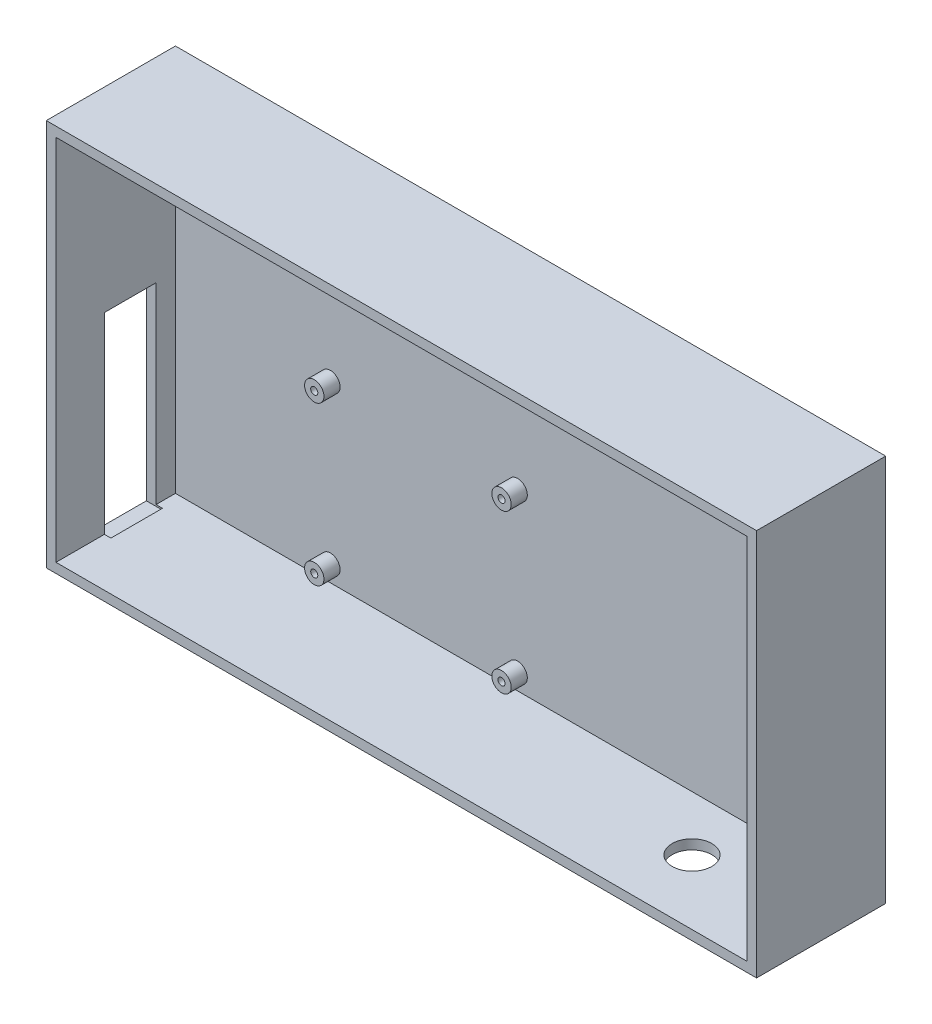
ISO-10303-21;
HEADER;
FILE_DESCRIPTION(('STEP AP214'),'2;1');
FILE_NAME('part.step','',(''),(''),'','','');
FILE_SCHEMA(('AUTOMOTIVE_DESIGN { 1 0 10303 214 1 1 1 1 }'));
ENDSEC;
DATA;
#1=APPLICATION_CONTEXT('core data for automotive mechanical design processes');
#2=APPLICATION_PROTOCOL_DEFINITION('international standard','automotive_design',2000,#1);
#3=PRODUCT_CONTEXT('',#1,'mechanical');
#4=PRODUCT('Part','Part','',(#3));
#5=PRODUCT_RELATED_PRODUCT_CATEGORY('part','',(#4));
#6=PRODUCT_DEFINITION_FORMATION('','',#4);
#7=PRODUCT_DEFINITION_CONTEXT('part definition',#1,'design');
#8=PRODUCT_DEFINITION('design','',#6,#7);
#9=PRODUCT_DEFINITION_SHAPE('','',#8);
#10=(LENGTH_UNIT() NAMED_UNIT(*) SI_UNIT(.MILLI.,.METRE.));
#11=(NAMED_UNIT(*) PLANE_ANGLE_UNIT() SI_UNIT($,.RADIAN.));
#12=(NAMED_UNIT(*) SI_UNIT($,.STERADIAN.) SOLID_ANGLE_UNIT());
#13=UNCERTAINTY_MEASURE_WITH_UNIT(LENGTH_MEASURE(1.E-05),#10,'distance_accuracy_value','');
#14=(GEOMETRIC_REPRESENTATION_CONTEXT(3) GLOBAL_UNCERTAINTY_ASSIGNED_CONTEXT((#13)) GLOBAL_UNIT_ASSIGNED_CONTEXT((#10,
#11,#12)) REPRESENTATION_CONTEXT('',''));
#15=CARTESIAN_POINT('',(0.,0.,0.));
#16=DIRECTION('',(0.,0.,1.));
#17=DIRECTION('',(1.,0.,0.));
#18=AXIS2_PLACEMENT_3D('',#15,#16,#17);
#19=CARTESIAN_POINT('',(0.,0.,40.));
#20=DIRECTION('',(0.,0.,1.));
#21=DIRECTION('',(1.,0.,0.));
#22=AXIS2_PLACEMENT_3D('',#19,#20,#21);
#23=PLANE('',#22);
#24=DIRECTION('',(-1.,0.,0.));
#25=VECTOR('',#24,1.);
#26=CARTESIAN_POINT('',(0.,-57.,40.));
#27=LINE('',#26,#25);
#28=CARTESIAN_POINT('',(107.,-57.,40.));
#29=VERTEX_POINT('',#28);
#30=CARTESIAN_POINT('',(-107.,-57.,40.));
#31=VERTEX_POINT('',#30);
#32=EDGE_CURVE('E220',#29,#31,#27,.T.);
#33=ORIENTED_EDGE('',*,*,#32,.T.);
#34=DIRECTION('',(0.,1.,0.));
#35=VECTOR('',#34,1.);
#36=CARTESIAN_POINT('',(-107.,0.,40.));
#37=LINE('',#36,#35);
#38=CARTESIAN_POINT('',(-107.,57.,40.));
#39=VERTEX_POINT('',#38);
#40=EDGE_CURVE('E212',#31,#39,#37,.T.);
#41=ORIENTED_EDGE('',*,*,#40,.T.);
#42=DIRECTION('',(1.,0.,0.));
#43=VECTOR('',#42,1.);
#44=CARTESIAN_POINT('',(0.,57.,40.));
#45=LINE('',#44,#43);
#46=CARTESIAN_POINT('',(107.,57.,40.));
#47=VERTEX_POINT('',#46);
#48=EDGE_CURVE('E211',#39,#47,#45,.T.);
#49=ORIENTED_EDGE('',*,*,#48,.T.);
#50=DIRECTION('',(0.,-1.,0.));
#51=VECTOR('',#50,1.);
#52=CARTESIAN_POINT('',(107.,0.,40.));
#53=LINE('',#52,#51);
#54=EDGE_CURVE('E208',#47,#29,#53,.T.);
#55=ORIENTED_EDGE('',*,*,#54,.T.);
#56=EDGE_LOOP('',(#33,#41,#49,#55));
#57=FACE_BOUND('',#56,.T.);
#58=DIRECTION('',(-1.,0.,0.));
#59=VECTOR('',#58,1.);
#60=CARTESIAN_POINT('',(0.,-60.,40.));
#61=LINE('',#60,#59);
#62=CARTESIAN_POINT('',(110.,-60.,40.));
#63=VERTEX_POINT('',#62);
#64=CARTESIAN_POINT('',(-110.,-60.,40.));
#65=VERTEX_POINT('',#64);
#66=EDGE_CURVE('E253',#63,#65,#61,.T.);
#67=ORIENTED_EDGE('',*,*,#66,.F.);
#68=DIRECTION('',(0.,-1.,0.));
#69=VECTOR('',#68,1.);
#70=CARTESIAN_POINT('',(110.,0.,40.));
#71=LINE('',#70,#69);
#72=CARTESIAN_POINT('',(110.,60.,40.));
#73=VERTEX_POINT('',#72);
#74=EDGE_CURVE('E243',#73,#63,#71,.T.);
#75=ORIENTED_EDGE('',*,*,#74,.F.);
#76=DIRECTION('',(1.,0.,0.));
#77=VECTOR('',#76,1.);
#78=CARTESIAN_POINT('',(0.,60.,40.));
#79=LINE('',#78,#77);
#80=CARTESIAN_POINT('',(-110.,60.,40.));
#81=VERTEX_POINT('',#80);
#82=EDGE_CURVE('E250',#81,#73,#79,.T.);
#83=ORIENTED_EDGE('',*,*,#82,.F.);
#84=DIRECTION('',(0.,1.,0.));
#85=VECTOR('',#84,1.);
#86=CARTESIAN_POINT('',(-110.,0.,40.));
#87=LINE('',#86,#85);
#88=EDGE_CURVE('E247',#65,#81,#87,.T.);
#89=ORIENTED_EDGE('',*,*,#88,.F.);
#90=EDGE_LOOP('',(#67,#75,#83,#89));
#91=FACE_BOUND('',#90,.T.);
#92=ADVANCED_FACE('F16',(#57,#91),#23,.T.);
#93=CARTESIAN_POINT('',(0.,-60.,0.));
#94=DIRECTION('',(0.,-1.,0.));
#95=DIRECTION('',(0.,0.,-1.));
#96=AXIS2_PLACEMENT_3D('',#93,#94,#95);
#97=PLANE('',#96);
#98=CARTESIAN_POINT('',(70.,-60.,20.));
#99=DIRECTION('',(0.,-1.,0.));
#100=DIRECTION('',(0.,0.,-1.));
#101=AXIS2_PLACEMENT_3D('',#98,#99,#100);
#102=CIRCLE('',#101,6.15);
#103=CARTESIAN_POINT('',(70.,-60.,13.85));
#104=VERTEX_POINT('',#103);
#105=EDGE_CURVE('E153',#104,#104,#102,.T.);
#106=ORIENTED_EDGE('',*,*,#105,.F.);
#107=EDGE_LOOP('',(#106));
#108=FACE_BOUND('',#107,.T.);
#109=DIRECTION('',(0.,0.,1.));
#110=VECTOR('',#109,1.);
#111=CARTESIAN_POINT('',(110.,-60.,0.));
#112=LINE('',#111,#110);
#113=CARTESIAN_POINT('',(110.,-60.,0.));
#114=VERTEX_POINT('',#113);
#115=EDGE_CURVE('E227',#114,#63,#112,.T.);
#116=ORIENTED_EDGE('',*,*,#115,.T.);
#117=ORIENTED_EDGE('',*,*,#66,.T.);
#118=DIRECTION('',(0.,0.,1.));
#119=VECTOR('',#118,1.);
#120=CARTESIAN_POINT('',(-110.,-60.,0.));
#121=LINE('',#120,#119);
#122=CARTESIAN_POINT('',(-110.,-60.,0.));
#123=VERTEX_POINT('',#122);
#124=EDGE_CURVE('E241',#123,#65,#121,.T.);
#125=ORIENTED_EDGE('',*,*,#124,.F.);
#126=DIRECTION('',(1.,0.,0.));
#127=VECTOR('',#126,1.);
#128=CARTESIAN_POINT('',(0.,-60.,0.));
#129=LINE('',#128,#127);
#130=EDGE_CURVE('E219',#123,#114,#129,.T.);
#131=ORIENTED_EDGE('',*,*,#130,.T.);
#132=EDGE_LOOP('',(#116,#117,#125,#131));
#133=FACE_BOUND('',#132,.T.);
#134=ADVANCED_FACE('F313',(#108,#133),#97,.T.);
#135=CARTESIAN_POINT('',(-110.,0.,0.));
#136=DIRECTION('',(-1.,0.,0.));
#137=DIRECTION('',(0.,0.,1.));
#138=AXIS2_PLACEMENT_3D('',#135,#136,#137);
#139=PLANE('',#138);
#140=DIRECTION('',(0.,1.,0.));
#141=VECTOR('',#140,1.);
#142=CARTESIAN_POINT('',(-110.,0.,25.));
#143=LINE('',#142,#141);
#144=CARTESIAN_POINT('',(-110.,-57.5,25.));
#145=VERTEX_POINT('',#144);
#146=CARTESIAN_POINT('',(-110.,2.5,25.));
#147=VERTEX_POINT('',#146);
#148=EDGE_CURVE('E147',#145,#147,#143,.T.);
#149=ORIENTED_EDGE('',*,*,#148,.F.);
#150=DIRECTION('',(0.,0.,1.));
#151=VECTOR('',#150,1.);
#152=CARTESIAN_POINT('',(-110.,-57.5,0.));
#153=LINE('',#152,#151);
#154=CARTESIAN_POINT('',(-110.,-57.5,9.));
#155=VERTEX_POINT('',#154);
#156=EDGE_CURVE('E10',#155,#145,#153,.T.);
#157=ORIENTED_EDGE('',*,*,#156,.F.);
#158=DIRECTION('',(0.,-1.,0.));
#159=VECTOR('',#158,1.);
#160=CARTESIAN_POINT('',(-110.,0.,9.));
#161=LINE('',#160,#159);
#162=CARTESIAN_POINT('',(-110.,2.5,9.));
#163=VERTEX_POINT('',#162);
#164=EDGE_CURVE('E118',#163,#155,#161,.T.);
#165=ORIENTED_EDGE('',*,*,#164,.F.);
#166=DIRECTION('',(0.,0.,-1.));
#167=VECTOR('',#166,1.);
#168=CARTESIAN_POINT('',(-110.,2.5,0.));
#169=LINE('',#168,#167);
#170=EDGE_CURVE('E144',#147,#163,#169,.T.);
#171=ORIENTED_EDGE('',*,*,#170,.F.);
#172=EDGE_LOOP('',(#149,#157,#165,#171));
#173=FACE_BOUND('',#172,.T.);
#174=ORIENTED_EDGE('',*,*,#124,.T.);
#175=ORIENTED_EDGE('',*,*,#88,.T.);
#176=DIRECTION('',(0.,0.,1.));
#177=VECTOR('',#176,1.);
#178=CARTESIAN_POINT('',(-110.,60.,0.));
#179=LINE('',#178,#177);
#180=CARTESIAN_POINT('',(-110.,60.,0.));
#181=VERTEX_POINT('',#180);
#182=EDGE_CURVE('E238',#181,#81,#179,.T.);
#183=ORIENTED_EDGE('',*,*,#182,.F.);
#184=DIRECTION('',(0.,-1.,0.));
#185=VECTOR('',#184,1.);
#186=CARTESIAN_POINT('',(-110.,0.,0.));
#187=LINE('',#186,#185);
#188=EDGE_CURVE('E224',#181,#123,#187,.T.);
#189=ORIENTED_EDGE('',*,*,#188,.T.);
#190=EDGE_LOOP('',(#174,#175,#183,#189));
#191=FACE_BOUND('',#190,.T.);
#192=ADVANCED_FACE('F307',(#173,#191),#139,.T.);
#193=CARTESIAN_POINT('',(0.,60.,0.));
#194=DIRECTION('',(0.,1.,0.));
#195=DIRECTION('',(0.,0.,1.));
#196=AXIS2_PLACEMENT_3D('',#193,#194,#195);
#197=PLANE('',#196);
#198=ORIENTED_EDGE('',*,*,#182,.T.);
#199=ORIENTED_EDGE('',*,*,#82,.T.);
#200=DIRECTION('',(0.,0.,1.));
#201=VECTOR('',#200,1.);
#202=CARTESIAN_POINT('',(110.,60.,0.));
#203=LINE('',#202,#201);
#204=CARTESIAN_POINT('',(110.,60.,0.));
#205=VERTEX_POINT('',#204);
#206=EDGE_CURVE('E234',#205,#73,#203,.T.);
#207=ORIENTED_EDGE('',*,*,#206,.F.);
#208=DIRECTION('',(-1.,0.,0.));
#209=VECTOR('',#208,1.);
#210=CARTESIAN_POINT('',(0.,60.,0.));
#211=LINE('',#210,#209);
#212=EDGE_CURVE('E229',#205,#181,#211,.T.);
#213=ORIENTED_EDGE('',*,*,#212,.T.);
#214=EDGE_LOOP('',(#198,#199,#207,#213));
#215=FACE_BOUND('',#214,.T.);
#216=ADVANCED_FACE('F309',(#215),#197,.T.);
#217=CARTESIAN_POINT('',(0.,0.,0.));
#218=DIRECTION('',(0.,0.,-1.));
#219=DIRECTION('',(-1.,0.,0.));
#220=AXIS2_PLACEMENT_3D('',#217,#218,#219);
#221=PLANE('',#220);
#222=DIRECTION('',(0.,1.,0.));
#223=VECTOR('',#222,1.);
#224=CARTESIAN_POINT('',(110.,0.,0.));
#225=LINE('',#224,#223);
#226=EDGE_CURVE('E221',#114,#205,#225,.T.);
#227=ORIENTED_EDGE('',*,*,#226,.F.);
#228=ORIENTED_EDGE('',*,*,#130,.F.);
#229=ORIENTED_EDGE('',*,*,#188,.F.);
#230=ORIENTED_EDGE('',*,*,#212,.F.);
#231=EDGE_LOOP('',(#227,#228,#229,#230));
#232=FACE_BOUND('',#231,.T.);
#233=ADVANCED_FACE('F323',(#232),#221,.T.);
#234=CARTESIAN_POINT('',(110.,0.,0.));
#235=DIRECTION('',(1.,0.,0.));
#236=DIRECTION('',(0.,0.,-1.));
#237=AXIS2_PLACEMENT_3D('',#234,#235,#236);
#238=PLANE('',#237);
#239=ORIENTED_EDGE('',*,*,#226,.T.);
#240=ORIENTED_EDGE('',*,*,#206,.T.);
#241=ORIENTED_EDGE('',*,*,#74,.T.);
#242=ORIENTED_EDGE('',*,*,#115,.F.);
#243=EDGE_LOOP('',(#239,#240,#241,#242));
#244=FACE_BOUND('',#243,.T.);
#245=ADVANCED_FACE('F324',(#244),#238,.T.);
#246=CARTESIAN_POINT('',(0.,-57.,3.));
#247=DIRECTION('',(0.,-1.,0.));
#248=DIRECTION('',(0.,0.,-1.));
#249=AXIS2_PLACEMENT_3D('',#246,#247,#248);
#250=PLANE('',#249);
#251=CARTESIAN_POINT('',(70.,-57.,20.));
#252=DIRECTION('',(0.,-1.,0.));
#253=DIRECTION('',(0.,0.,-1.));
#254=AXIS2_PLACEMENT_3D('',#251,#252,#253);
#255=CIRCLE('',#254,6.15);
#256=CARTESIAN_POINT('',(70.,-57.,13.85));
#257=VERTEX_POINT('',#256);
#258=EDGE_CURVE('E155',#257,#257,#255,.T.);
#259=ORIENTED_EDGE('',*,*,#258,.T.);
#260=EDGE_LOOP('',(#259));
#261=FACE_BOUND('',#260,.T.);
#262=DIRECTION('',(0.,0.,1.));
#263=VECTOR('',#262,1.);
#264=CARTESIAN_POINT('',(-105.,-57.,3.));
#265=LINE('',#264,#263);
#266=CARTESIAN_POINT('',(-105.,-57.,9.));
#267=VERTEX_POINT('',#266);
#268=CARTESIAN_POINT('',(-105.,-57.,25.));
#269=VERTEX_POINT('',#268);
#270=EDGE_CURVE('E23',#267,#269,#265,.T.);
#271=ORIENTED_EDGE('',*,*,#270,.T.);
#272=DIRECTION('',(-1.,0.,0.));
#273=VECTOR('',#272,1.);
#274=CARTESIAN_POINT('',(0.,-57.,25.));
#275=LINE('',#274,#273);
#276=CARTESIAN_POINT('',(-107.,-57.,25.));
#277=VERTEX_POINT('',#276);
#278=EDGE_CURVE('E150',#269,#277,#275,.T.);
#279=ORIENTED_EDGE('',*,*,#278,.T.);
#280=DIRECTION('',(0.,0.,1.));
#281=VECTOR('',#280,1.);
#282=CARTESIAN_POINT('',(-107.,-57.,3.));
#283=LINE('',#282,#281);
#284=EDGE_CURVE('E204',#277,#31,#283,.T.);
#285=ORIENTED_EDGE('',*,*,#284,.T.);
#286=ORIENTED_EDGE('',*,*,#32,.F.);
#287=DIRECTION('',(0.,0.,1.));
#288=VECTOR('',#287,1.);
#289=CARTESIAN_POINT('',(107.,-57.,3.));
#290=LINE('',#289,#288);
#291=CARTESIAN_POINT('',(107.,-57.,3.));
#292=VERTEX_POINT('',#291);
#293=EDGE_CURVE('E191',#292,#29,#290,.T.);
#294=ORIENTED_EDGE('',*,*,#293,.F.);
#295=DIRECTION('',(1.,0.,0.));
#296=VECTOR('',#295,1.);
#297=CARTESIAN_POINT('',(0.,-57.,3.));
#298=LINE('',#297,#296);
#299=CARTESIAN_POINT('',(-107.,-57.,3.));
#300=VERTEX_POINT('',#299);
#301=EDGE_CURVE('E182',#300,#292,#298,.T.);
#302=ORIENTED_EDGE('',*,*,#301,.F.);
#303=CARTESIAN_POINT('',(-107.,-57.,9.));
#304=VERTEX_POINT('',#303);
#305=EDGE_CURVE('E202',#300,#304,#283,.T.);
#306=ORIENTED_EDGE('',*,*,#305,.T.);
#307=DIRECTION('',(1.,0.,0.));
#308=VECTOR('',#307,1.);
#309=CARTESIAN_POINT('',(0.,-57.,9.));
#310=LINE('',#309,#308);
#311=EDGE_CURVE('E38',#304,#267,#310,.T.);
#312=ORIENTED_EDGE('',*,*,#311,.T.);
#313=EDGE_LOOP('',(#271,#279,#285,#286,#294,#302,#306,#312));
#314=FACE_BOUND('',#313,.T.);
#315=ADVANCED_FACE('F284',(#261,#314),#250,.F.);
#316=CARTESIAN_POINT('',(-107.,0.,3.));
#317=DIRECTION('',(-1.,0.,0.));
#318=DIRECTION('',(0.,0.,1.));
#319=AXIS2_PLACEMENT_3D('',#316,#317,#318);
#320=PLANE('',#319);
#321=ORIENTED_EDGE('',*,*,#284,.F.);
#322=DIRECTION('',(0.,1.,0.));
#323=VECTOR('',#322,1.);
#324=CARTESIAN_POINT('',(-107.,0.,25.));
#325=LINE('',#324,#323);
#326=CARTESIAN_POINT('',(-107.,2.5,25.));
#327=VERTEX_POINT('',#326);
#328=EDGE_CURVE('E278',#277,#327,#325,.T.);
#329=ORIENTED_EDGE('',*,*,#328,.T.);
#330=DIRECTION('',(0.,0.,-1.));
#331=VECTOR('',#330,1.);
#332=CARTESIAN_POINT('',(-107.,2.5,3.));
#333=LINE('',#332,#331);
#334=CARTESIAN_POINT('',(-107.,2.5,9.));
#335=VERTEX_POINT('',#334);
#336=EDGE_CURVE('E280',#327,#335,#333,.T.);
#337=ORIENTED_EDGE('',*,*,#336,.T.);
#338=DIRECTION('',(0.,-1.,0.));
#339=VECTOR('',#338,1.);
#340=CARTESIAN_POINT('',(-107.,0.,9.));
#341=LINE('',#340,#339);
#342=EDGE_CURVE('E271',#335,#304,#341,.T.);
#343=ORIENTED_EDGE('',*,*,#342,.T.);
#344=ORIENTED_EDGE('',*,*,#305,.F.);
#345=DIRECTION('',(0.,-1.,0.));
#346=VECTOR('',#345,1.);
#347=CARTESIAN_POINT('',(-107.,0.,3.));
#348=LINE('',#347,#346);
#349=CARTESIAN_POINT('',(-107.,57.,3.));
#350=VERTEX_POINT('',#349);
#351=EDGE_CURVE('E190',#350,#300,#348,.T.);
#352=ORIENTED_EDGE('',*,*,#351,.F.);
#353=DIRECTION('',(0.,0.,1.));
#354=VECTOR('',#353,1.);
#355=CARTESIAN_POINT('',(-107.,57.,3.));
#356=LINE('',#355,#354);
#357=EDGE_CURVE('E203',#350,#39,#356,.T.);
#358=ORIENTED_EDGE('',*,*,#357,.T.);
#359=ORIENTED_EDGE('',*,*,#40,.F.);
#360=EDGE_LOOP('',(#321,#329,#337,#343,#344,#352,#358,#359));
#361=FACE_BOUND('',#360,.T.);
#362=ADVANCED_FACE('F288',(#361),#320,.F.);
#363=CARTESIAN_POINT('',(0.,57.,3.));
#364=DIRECTION('',(0.,1.,0.));
#365=DIRECTION('',(0.,0.,1.));
#366=AXIS2_PLACEMENT_3D('',#363,#364,#365);
#367=PLANE('',#366);
#368=ORIENTED_EDGE('',*,*,#357,.F.);
#369=DIRECTION('',(-1.,0.,0.));
#370=VECTOR('',#369,1.);
#371=CARTESIAN_POINT('',(0.,57.,3.));
#372=LINE('',#371,#370);
#373=CARTESIAN_POINT('',(107.,57.,3.));
#374=VERTEX_POINT('',#373);
#375=EDGE_CURVE('E195',#374,#350,#372,.T.);
#376=ORIENTED_EDGE('',*,*,#375,.F.);
#377=DIRECTION('',(0.,0.,1.));
#378=VECTOR('',#377,1.);
#379=CARTESIAN_POINT('',(107.,57.,3.));
#380=LINE('',#379,#378);
#381=EDGE_CURVE('E196',#374,#47,#380,.T.);
#382=ORIENTED_EDGE('',*,*,#381,.T.);
#383=ORIENTED_EDGE('',*,*,#48,.F.);
#384=EDGE_LOOP('',(#368,#376,#382,#383));
#385=FACE_BOUND('',#384,.T.);
#386=ADVANCED_FACE('F292',(#385),#367,.F.);
#387=CARTESIAN_POINT('',(0.,0.,3.));
#388=DIRECTION('',(0.,0.,-1.));
#389=DIRECTION('',(-1.,0.,0.));
#390=AXIS2_PLACEMENT_3D('',#387,#388,#389);
#391=PLANE('',#390);
#392=CARTESIAN_POINT('',(-1.,-3.,3.));
#393=DIRECTION('',(0.,0.,-1.));
#394=DIRECTION('',(-1.,0.,0.));
#395=AXIS2_PLACEMENT_3D('',#392,#393,#394);
#396=CIRCLE('',#395,3.);
#397=CARTESIAN_POINT('',(-4.,-3.,3.));
#398=VERTEX_POINT('',#397);
#399=EDGE_CURVE('E159',#398,#398,#396,.T.);
#400=ORIENTED_EDGE('',*,*,#399,.T.);
#401=EDGE_LOOP('',(#400));
#402=FACE_BOUND('',#401,.T.);
#403=CARTESIAN_POINT('',(-1.,-52.,3.));
#404=DIRECTION('',(0.,0.,-1.));
#405=DIRECTION('',(-1.,0.,0.));
#406=AXIS2_PLACEMENT_3D('',#403,#404,#405);
#407=CIRCLE('',#406,3.);
#408=CARTESIAN_POINT('',(-4.,-52.,3.));
#409=VERTEX_POINT('',#408);
#410=EDGE_CURVE('E167',#409,#409,#407,.T.);
#411=ORIENTED_EDGE('',*,*,#410,.T.);
#412=EDGE_LOOP('',(#411));
#413=FACE_BOUND('',#412,.T.);
#414=CARTESIAN_POINT('',(-59.,-3.,3.));
#415=DIRECTION('',(0.,0.,-1.));
#416=DIRECTION('',(-1.,0.,0.));
#417=AXIS2_PLACEMENT_3D('',#414,#415,#416);
#418=CIRCLE('',#417,3.);
#419=CARTESIAN_POINT('',(-62.,-3.,3.));
#420=VERTEX_POINT('',#419);
#421=EDGE_CURVE('E174',#420,#420,#418,.T.);
#422=ORIENTED_EDGE('',*,*,#421,.T.);
#423=EDGE_LOOP('',(#422));
#424=FACE_BOUND('',#423,.T.);
#425=CARTESIAN_POINT('',(-59.,-52.,3.));
#426=DIRECTION('',(0.,0.,-1.));
#427=DIRECTION('',(-1.,0.,0.));
#428=AXIS2_PLACEMENT_3D('',#425,#426,#427);
#429=CIRCLE('',#428,3.);
#430=CARTESIAN_POINT('',(-62.,-52.,3.));
#431=VERTEX_POINT('',#430);
#432=EDGE_CURVE('E179',#431,#431,#429,.T.);
#433=ORIENTED_EDGE('',*,*,#432,.T.);
#434=EDGE_LOOP('',(#433));
#435=FACE_BOUND('',#434,.T.);
#436=DIRECTION('',(0.,1.,0.));
#437=VECTOR('',#436,1.);
#438=CARTESIAN_POINT('',(107.,0.,3.));
#439=LINE('',#438,#437);
#440=EDGE_CURVE('E187',#292,#374,#439,.T.);
#441=ORIENTED_EDGE('',*,*,#440,.T.);
#442=ORIENTED_EDGE('',*,*,#375,.T.);
#443=ORIENTED_EDGE('',*,*,#351,.T.);
#444=ORIENTED_EDGE('',*,*,#301,.T.);
#445=EDGE_LOOP('',(#441,#442,#443,#444));
#446=FACE_BOUND('',#445,.T.);
#447=ADVANCED_FACE('F289',(#402,#413,#424,#435,#446),#391,.F.);
#448=CARTESIAN_POINT('',(107.,0.,3.));
#449=DIRECTION('',(1.,0.,0.));
#450=DIRECTION('',(0.,0.,-1.));
#451=AXIS2_PLACEMENT_3D('',#448,#449,#450);
#452=PLANE('',#451);
#453=ORIENTED_EDGE('',*,*,#440,.F.);
#454=ORIENTED_EDGE('',*,*,#293,.T.);
#455=ORIENTED_EDGE('',*,*,#54,.F.);
#456=ORIENTED_EDGE('',*,*,#381,.F.);
#457=EDGE_LOOP('',(#453,#454,#455,#456));
#458=FACE_BOUND('',#457,.T.);
#459=ADVANCED_FACE('F400',(#458),#452,.F.);
#460=CARTESIAN_POINT('',(-59.,-52.,0.));
#461=DIRECTION('',(0.,0.,1.));
#462=DIRECTION('',(1.,0.,0.));
#463=AXIS2_PLACEMENT_3D('',#460,#461,#462);
#464=CYLINDRICAL_SURFACE('',#463,3.);
#465=CARTESIAN_POINT('',(-59.,-52.,8.));
#466=DIRECTION('',(0.,0.,-1.));
#467=DIRECTION('',(-1.,0.,0.));
#468=AXIS2_PLACEMENT_3D('',#465,#466,#467);
#469=CIRCLE('',#468,3.);
#470=CARTESIAN_POINT('',(-62.,-52.,8.));
#471=VERTEX_POINT('',#470);
#472=EDGE_CURVE('E180',#471,#471,#469,.T.);
#473=ORIENTED_EDGE('',*,*,#472,.T.);
#474=EDGE_LOOP('',(#473));
#475=FACE_BOUND('',#474,.T.);
#476=ORIENTED_EDGE('',*,*,#432,.F.);
#477=EDGE_LOOP('',(#476));
#478=FACE_BOUND('',#477,.T.);
#479=ADVANCED_FACE('F408',(#475,#478),#464,.T.);
#480=CARTESIAN_POINT('',(-59.,-52.,8.));
#481=DIRECTION('',(0.,0.,1.));
#482=DIRECTION('',(1.,0.,0.));
#483=AXIS2_PLACEMENT_3D('',#480,#481,#482);
#484=PLANE('',#483);
#485=CARTESIAN_POINT('',(-59.,-52.,8.));
#486=DIRECTION('',(0.,0.,1.));
#487=DIRECTION('',(1.,0.,0.));
#488=AXIS2_PLACEMENT_3D('',#485,#486,#487);
#489=CIRCLE('',#488,1.1);
#490=CARTESIAN_POINT('',(-57.9,-52.,8.));
#491=VERTEX_POINT('',#490);
#492=EDGE_CURVE('E185',#491,#491,#489,.T.);
#493=ORIENTED_EDGE('',*,*,#492,.F.);
#494=EDGE_LOOP('',(#493));
#495=FACE_BOUND('',#494,.T.);
#496=ORIENTED_EDGE('',*,*,#472,.F.);
#497=EDGE_LOOP('',(#496));
#498=FACE_BOUND('',#497,.T.);
#499=ADVANCED_FACE('F420',(#495,#498),#484,.T.);
#500=CARTESIAN_POINT('',(-59.,-52.,3.));
#501=DIRECTION('',(0.,0.,1.));
#502=DIRECTION('',(1.,0.,0.));
#503=AXIS2_PLACEMENT_3D('',#500,#501,#502);
#504=CYLINDRICAL_SURFACE('',#503,1.1);
#505=ORIENTED_EDGE('',*,*,#492,.T.);
#506=EDGE_LOOP('',(#505));
#507=FACE_BOUND('',#506,.T.);
#508=CARTESIAN_POINT('',(-59.,-52.,3.));
#509=DIRECTION('',(0.,0.,-1.));
#510=DIRECTION('',(-1.,0.,0.));
#511=AXIS2_PLACEMENT_3D('',#508,#509,#510);
#512=CIRCLE('',#511,1.1);
#513=CARTESIAN_POINT('',(-60.1,-52.,3.));
#514=VERTEX_POINT('',#513);
#515=EDGE_CURVE('E251',#514,#514,#512,.T.);
#516=ORIENTED_EDGE('',*,*,#515,.T.);
#517=EDGE_LOOP('',(#516));
#518=FACE_BOUND('',#517,.T.);
#519=ADVANCED_FACE('F427',(#507,#518),#504,.F.);
#520=ORIENTED_EDGE('',*,*,#515,.F.);
#521=EDGE_LOOP('',(#520));
#522=FACE_BOUND('',#521,.T.);
#523=ADVANCED_FACE('F405',(#522),#391,.F.);
#524=CARTESIAN_POINT('',(-59.,-3.,0.));
#525=DIRECTION('',(0.,0.,1.));
#526=DIRECTION('',(1.,0.,0.));
#527=AXIS2_PLACEMENT_3D('',#524,#525,#526);
#528=CYLINDRICAL_SURFACE('',#527,3.);
#529=CARTESIAN_POINT('',(-59.,-3.,8.));
#530=DIRECTION('',(0.,0.,-1.));
#531=DIRECTION('',(-1.,0.,0.));
#532=AXIS2_PLACEMENT_3D('',#529,#530,#531);
#533=CIRCLE('',#532,3.);
#534=CARTESIAN_POINT('',(-62.,-3.,8.));
#535=VERTEX_POINT('',#534);
#536=EDGE_CURVE('E168',#535,#535,#533,.T.);
#537=ORIENTED_EDGE('',*,*,#536,.T.);
#538=EDGE_LOOP('',(#537));
#539=FACE_BOUND('',#538,.T.);
#540=ORIENTED_EDGE('',*,*,#421,.F.);
#541=EDGE_LOOP('',(#540));
#542=FACE_BOUND('',#541,.T.);
#543=ADVANCED_FACE('F449',(#539,#542),#528,.T.);
#544=CARTESIAN_POINT('',(-59.,-3.,8.));
#545=DIRECTION('',(0.,0.,1.));
#546=DIRECTION('',(1.,0.,0.));
#547=AXIS2_PLACEMENT_3D('',#544,#545,#546);
#548=PLANE('',#547);
#549=CARTESIAN_POINT('',(-59.,-3.,8.));
#550=DIRECTION('',(0.,0.,1.));
#551=DIRECTION('',(1.,0.,0.));
#552=AXIS2_PLACEMENT_3D('',#549,#550,#551);
#553=CIRCLE('',#552,1.1);
#554=CARTESIAN_POINT('',(-57.9,-3.,8.));
#555=VERTEX_POINT('',#554);
#556=EDGE_CURVE('E173',#555,#555,#553,.T.);
#557=ORIENTED_EDGE('',*,*,#556,.F.);
#558=EDGE_LOOP('',(#557));
#559=FACE_BOUND('',#558,.T.);
#560=ORIENTED_EDGE('',*,*,#536,.F.);
#561=EDGE_LOOP('',(#560));
#562=FACE_BOUND('',#561,.T.);
#563=ADVANCED_FACE('F458',(#559,#562),#548,.T.);
#564=CARTESIAN_POINT('',(-59.,-3.,3.));
#565=DIRECTION('',(0.,0.,1.));
#566=DIRECTION('',(1.,0.,0.));
#567=AXIS2_PLACEMENT_3D('',#564,#565,#566);
#568=CYLINDRICAL_SURFACE('',#567,1.1);
#569=ORIENTED_EDGE('',*,*,#556,.T.);
#570=EDGE_LOOP('',(#569));
#571=FACE_BOUND('',#570,.T.);
#572=CARTESIAN_POINT('',(-59.,-3.,3.));
#573=DIRECTION('',(0.,0.,-1.));
#574=DIRECTION('',(-1.,0.,0.));
#575=AXIS2_PLACEMENT_3D('',#572,#573,#574);
#576=CIRCLE('',#575,1.1);
#577=CARTESIAN_POINT('',(-60.1,-3.,3.));
#578=VERTEX_POINT('',#577);
#579=EDGE_CURVE('E258',#578,#578,#576,.T.);
#580=ORIENTED_EDGE('',*,*,#579,.T.);
#581=EDGE_LOOP('',(#580));
#582=FACE_BOUND('',#581,.T.);
#583=ADVANCED_FACE('F468',(#571,#582),#568,.F.);
#584=ORIENTED_EDGE('',*,*,#579,.F.);
#585=EDGE_LOOP('',(#584));
#586=FACE_BOUND('',#585,.T.);
#587=ADVANCED_FACE('F450',(#586),#391,.F.);
#588=CARTESIAN_POINT('',(-1.,-52.,0.));
#589=DIRECTION('',(0.,0.,1.));
#590=DIRECTION('',(1.,0.,0.));
#591=AXIS2_PLACEMENT_3D('',#588,#589,#590);
#592=CYLINDRICAL_SURFACE('',#591,3.);
#593=CARTESIAN_POINT('',(-1.,-52.,8.));
#594=DIRECTION('',(0.,0.,-1.));
#595=DIRECTION('',(-1.,0.,0.));
#596=AXIS2_PLACEMENT_3D('',#593,#594,#595);
#597=CIRCLE('',#596,3.);
#598=CARTESIAN_POINT('',(-4.,-52.,8.));
#599=VERTEX_POINT('',#598);
#600=EDGE_CURVE('E162',#599,#599,#597,.T.);
#601=ORIENTED_EDGE('',*,*,#600,.T.);
#602=EDGE_LOOP('',(#601));
#603=FACE_BOUND('',#602,.T.);
#604=ORIENTED_EDGE('',*,*,#410,.F.);
#605=EDGE_LOOP('',(#604));
#606=FACE_BOUND('',#605,.T.);
#607=ADVANCED_FACE('F490',(#603,#606),#592,.T.);
#608=CARTESIAN_POINT('',(-1.,-52.,8.));
#609=DIRECTION('',(0.,0.,1.));
#610=DIRECTION('',(1.,0.,0.));
#611=AXIS2_PLACEMENT_3D('',#608,#609,#610);
#612=PLANE('',#611);
#613=CARTESIAN_POINT('',(-1.,-52.,8.));
#614=DIRECTION('',(0.,0.,1.));
#615=DIRECTION('',(1.,0.,0.));
#616=AXIS2_PLACEMENT_3D('',#613,#614,#615);
#617=CIRCLE('',#616,1.1);
#618=CARTESIAN_POINT('',(0.1,-52.,8.));
#619=VERTEX_POINT('',#618);
#620=EDGE_CURVE('E170',#619,#619,#617,.T.);
#621=ORIENTED_EDGE('',*,*,#620,.F.);
#622=EDGE_LOOP('',(#621));
#623=FACE_BOUND('',#622,.T.);
#624=ORIENTED_EDGE('',*,*,#600,.F.);
#625=EDGE_LOOP('',(#624));
#626=FACE_BOUND('',#625,.T.);
#627=ADVANCED_FACE('F500',(#623,#626),#612,.T.);
#628=CARTESIAN_POINT('',(-1.,-52.,3.));
#629=DIRECTION('',(0.,0.,1.));
#630=DIRECTION('',(1.,0.,0.));
#631=AXIS2_PLACEMENT_3D('',#628,#629,#630);
#632=CYLINDRICAL_SURFACE('',#631,1.1);
#633=ORIENTED_EDGE('',*,*,#620,.T.);
#634=EDGE_LOOP('',(#633));
#635=FACE_BOUND('',#634,.T.);
#636=CARTESIAN_POINT('',(-1.,-52.,3.));
#637=DIRECTION('',(0.,0.,-1.));
#638=DIRECTION('',(-1.,0.,0.));
#639=AXIS2_PLACEMENT_3D('',#636,#637,#638);
#640=CIRCLE('',#639,1.1);
#641=CARTESIAN_POINT('',(-2.1,-52.,3.));
#642=VERTEX_POINT('',#641);
#643=EDGE_CURVE('E261',#642,#642,#640,.T.);
#644=ORIENTED_EDGE('',*,*,#643,.T.);
#645=EDGE_LOOP('',(#644));
#646=FACE_BOUND('',#645,.T.);
#647=ADVANCED_FACE('F510',(#635,#646),#632,.F.);
#648=ORIENTED_EDGE('',*,*,#643,.F.);
#649=EDGE_LOOP('',(#648));
#650=FACE_BOUND('',#649,.T.);
#651=ADVANCED_FACE('F487',(#650),#391,.F.);
#652=CARTESIAN_POINT('',(-1.,-3.,0.));
#653=DIRECTION('',(0.,0.,1.));
#654=DIRECTION('',(1.,0.,0.));
#655=AXIS2_PLACEMENT_3D('',#652,#653,#654);
#656=CYLINDRICAL_SURFACE('',#655,3.);
#657=CARTESIAN_POINT('',(-1.,-3.,8.));
#658=DIRECTION('',(0.,0.,-1.));
#659=DIRECTION('',(-1.,0.,0.));
#660=AXIS2_PLACEMENT_3D('',#657,#658,#659);
#661=CIRCLE('',#660,3.);
#662=CARTESIAN_POINT('',(-4.,-3.,8.));
#663=VERTEX_POINT('',#662);
#664=EDGE_CURVE('E160',#663,#663,#661,.T.);
#665=ORIENTED_EDGE('',*,*,#664,.T.);
#666=EDGE_LOOP('',(#665));
#667=FACE_BOUND('',#666,.T.);
#668=ORIENTED_EDGE('',*,*,#399,.F.);
#669=EDGE_LOOP('',(#668));
#670=FACE_BOUND('',#669,.T.);
#671=ADVANCED_FACE('F528',(#667,#670),#656,.T.);
#672=CARTESIAN_POINT('',(-1.,-3.,8.));
#673=DIRECTION('',(0.,0.,1.));
#674=DIRECTION('',(1.,0.,0.));
#675=AXIS2_PLACEMENT_3D('',#672,#673,#674);
#676=PLANE('',#675);
#677=CARTESIAN_POINT('',(-1.,-3.,8.));
#678=DIRECTION('',(0.,0.,1.));
#679=DIRECTION('',(1.,0.,0.));
#680=AXIS2_PLACEMENT_3D('',#677,#678,#679);
#681=CIRCLE('',#680,1.1);
#682=CARTESIAN_POINT('',(0.1,-3.,8.));
#683=VERTEX_POINT('',#682);
#684=EDGE_CURVE('E156',#683,#683,#681,.T.);
#685=ORIENTED_EDGE('',*,*,#684,.F.);
#686=EDGE_LOOP('',(#685));
#687=FACE_BOUND('',#686,.T.);
#688=ORIENTED_EDGE('',*,*,#664,.F.);
#689=EDGE_LOOP('',(#688));
#690=FACE_BOUND('',#689,.T.);
#691=ADVANCED_FACE('F532',(#687,#690),#676,.T.);
#692=CARTESIAN_POINT('',(-1.,-3.,3.));
#693=DIRECTION('',(0.,0.,1.));
#694=DIRECTION('',(1.,0.,0.));
#695=AXIS2_PLACEMENT_3D('',#692,#693,#694);
#696=CYLINDRICAL_SURFACE('',#695,1.1);
#697=ORIENTED_EDGE('',*,*,#684,.T.);
#698=EDGE_LOOP('',(#697));
#699=FACE_BOUND('',#698,.T.);
#700=CARTESIAN_POINT('',(-1.,-3.,3.));
#701=DIRECTION('',(0.,0.,-1.));
#702=DIRECTION('',(-1.,0.,0.));
#703=AXIS2_PLACEMENT_3D('',#700,#701,#702);
#704=CIRCLE('',#703,1.1);
#705=CARTESIAN_POINT('',(-2.1,-3.,3.));
#706=VERTEX_POINT('',#705);
#707=EDGE_CURVE('E266',#706,#706,#704,.T.);
#708=ORIENTED_EDGE('',*,*,#707,.T.);
#709=EDGE_LOOP('',(#708));
#710=FACE_BOUND('',#709,.T.);
#711=ADVANCED_FACE('F544',(#699,#710),#696,.F.);
#712=ORIENTED_EDGE('',*,*,#707,.F.);
#713=EDGE_LOOP('',(#712));
#714=FACE_BOUND('',#713,.T.);
#715=ADVANCED_FACE('F399',(#714),#391,.F.);
#716=CARTESIAN_POINT('',(70.,-61.,20.));
#717=DIRECTION('',(0.,1.,0.));
#718=DIRECTION('',(0.,0.,1.));
#719=AXIS2_PLACEMENT_3D('',#716,#717,#718);
#720=CYLINDRICAL_SURFACE('',#719,6.15);
#721=ORIENTED_EDGE('',*,*,#105,.T.);
#722=EDGE_LOOP('',(#721));
#723=FACE_BOUND('',#722,.T.);
#724=ORIENTED_EDGE('',*,*,#258,.F.);
#725=EDGE_LOOP('',(#724));
#726=FACE_BOUND('',#725,.T.);
#727=ADVANCED_FACE('F562',(#723,#726),#720,.F.);
#728=CARTESIAN_POINT('',(-105.,-27.5,9.));
#729=DIRECTION('',(1.,0.,0.));
#730=DIRECTION('',(0.,0.,-1.));
#731=AXIS2_PLACEMENT_3D('',#728,#729,#730);
#732=PLANE('',#731);
#733=DIRECTION('',(0.,1.,0.));
#734=VECTOR('',#733,1.);
#735=CARTESIAN_POINT('',(-105.,-27.5,9.));
#736=LINE('',#735,#734);
#737=CARTESIAN_POINT('',(-105.,-57.5,9.));
#738=VERTEX_POINT('',#737);
#739=EDGE_CURVE('E117',#738,#267,#736,.T.);
#740=ORIENTED_EDGE('',*,*,#739,.F.);
#741=DIRECTION('',(0.,0.,1.));
#742=VECTOR('',#741,1.);
#743=CARTESIAN_POINT('',(-105.,-57.5,9.));
#744=LINE('',#743,#742);
#745=CARTESIAN_POINT('',(-105.,-57.5,25.));
#746=VERTEX_POINT('',#745);
#747=EDGE_CURVE('E124',#738,#746,#744,.T.);
#748=ORIENTED_EDGE('',*,*,#747,.T.);
#749=DIRECTION('',(0.,-1.,0.));
#750=VECTOR('',#749,1.);
#751=CARTESIAN_POINT('',(-105.,-27.5,25.));
#752=LINE('',#751,#750);
#753=EDGE_CURVE('E131',#269,#746,#752,.T.);
#754=ORIENTED_EDGE('',*,*,#753,.F.);
#755=ORIENTED_EDGE('',*,*,#270,.F.);
#756=EDGE_LOOP('',(#740,#748,#754,#755));
#757=FACE_BOUND('',#756,.T.);
#758=ADVANCED_FACE('F132',(#757),#732,.F.);
#759=CARTESIAN_POINT('',(-108.5,-27.5,25.));
#760=DIRECTION('',(0.,0.,1.));
#761=DIRECTION('',(1.,0.,0.));
#762=AXIS2_PLACEMENT_3D('',#759,#760,#761);
#763=PLANE('',#762);
#764=ORIENTED_EDGE('',*,*,#148,.T.);
#765=DIRECTION('',(1.,0.,0.));
#766=VECTOR('',#765,1.);
#767=CARTESIAN_POINT('',(-108.5,2.5,25.));
#768=LINE('',#767,#766);
#769=EDGE_CURVE('E137',#147,#327,#768,.T.);
#770=ORIENTED_EDGE('',*,*,#769,.T.);
#771=ORIENTED_EDGE('',*,*,#328,.F.);
#772=ORIENTED_EDGE('',*,*,#278,.F.);
#773=ORIENTED_EDGE('',*,*,#753,.T.);
#774=DIRECTION('',(-1.,0.,0.));
#775=VECTOR('',#774,1.);
#776=CARTESIAN_POINT('',(-108.5,-57.5,25.));
#777=LINE('',#776,#775);
#778=EDGE_CURVE('E128',#746,#145,#777,.T.);
#779=ORIENTED_EDGE('',*,*,#778,.T.);
#780=EDGE_LOOP('',(#764,#770,#771,#772,#773,#779));
#781=FACE_BOUND('',#780,.T.);
#782=ADVANCED_FACE('F299',(#781),#763,.F.);
#783=CARTESIAN_POINT('',(-108.5,2.5,9.));
#784=DIRECTION('',(0.,1.,0.));
#785=DIRECTION('',(0.,0.,1.));
#786=AXIS2_PLACEMENT_3D('',#783,#784,#785);
#787=PLANE('',#786);
#788=ORIENTED_EDGE('',*,*,#170,.T.);
#789=DIRECTION('',(-1.,0.,0.));
#790=VECTOR('',#789,1.);
#791=CARTESIAN_POINT('',(-108.5,2.5,9.));
#792=LINE('',#791,#790);
#793=EDGE_CURVE('E28',#335,#163,#792,.T.);
#794=ORIENTED_EDGE('',*,*,#793,.F.);
#795=ORIENTED_EDGE('',*,*,#336,.F.);
#796=ORIENTED_EDGE('',*,*,#769,.F.);
#797=EDGE_LOOP('',(#788,#794,#795,#796));
#798=FACE_BOUND('',#797,.T.);
#799=ADVANCED_FACE('F304',(#798),#787,.F.);
#800=CARTESIAN_POINT('',(-108.5,-27.5,9.));
#801=DIRECTION('',(0.,0.,-1.));
#802=DIRECTION('',(-1.,0.,0.));
#803=AXIS2_PLACEMENT_3D('',#800,#801,#802);
#804=PLANE('',#803);
#805=ORIENTED_EDGE('',*,*,#164,.T.);
#806=DIRECTION('',(1.,0.,0.));
#807=VECTOR('',#806,1.);
#808=CARTESIAN_POINT('',(-108.5,-57.5,9.));
#809=LINE('',#808,#807);
#810=EDGE_CURVE('E114',#155,#738,#809,.T.);
#811=ORIENTED_EDGE('',*,*,#810,.T.);
#812=ORIENTED_EDGE('',*,*,#739,.T.);
#813=ORIENTED_EDGE('',*,*,#311,.F.);
#814=ORIENTED_EDGE('',*,*,#342,.F.);
#815=ORIENTED_EDGE('',*,*,#793,.T.);
#816=EDGE_LOOP('',(#805,#811,#812,#813,#814,#815));
#817=FACE_BOUND('',#816,.T.);
#818=ADVANCED_FACE('F113',(#817),#804,.F.);
#819=CARTESIAN_POINT('',(-108.5,-57.5,9.));
#820=DIRECTION('',(0.,-1.,0.));
#821=DIRECTION('',(0.,0.,-1.));
#822=AXIS2_PLACEMENT_3D('',#819,#820,#821);
#823=PLANE('',#822);
#824=ORIENTED_EDGE('',*,*,#156,.T.);
#825=ORIENTED_EDGE('',*,*,#778,.F.);
#826=ORIENTED_EDGE('',*,*,#747,.F.);
#827=ORIENTED_EDGE('',*,*,#810,.F.);
#828=EDGE_LOOP('',(#824,#825,#826,#827));
#829=FACE_BOUND('',#828,.T.);
#830=ADVANCED_FACE('F130',(#829),#823,.F.);
#831=CLOSED_SHELL('',(#92,#134,#192,#216,#233,#245,#315,#362,#386,#447,#459,#479,#499,#519,#523,
#543,#563,#583,#587,#607,#627,#647,#651,#671,#691,#711,#715,#727,#758,#782,#799,#818,#830));
#832=MANIFOLD_SOLID_BREP('B1',#831);
#833=ADVANCED_BREP_SHAPE_REPRESENTATION('',(#18,#832),#14);
#834=SHAPE_DEFINITION_REPRESENTATION(#9,#833);
ENDSEC;
END-ISO-10303-21;
